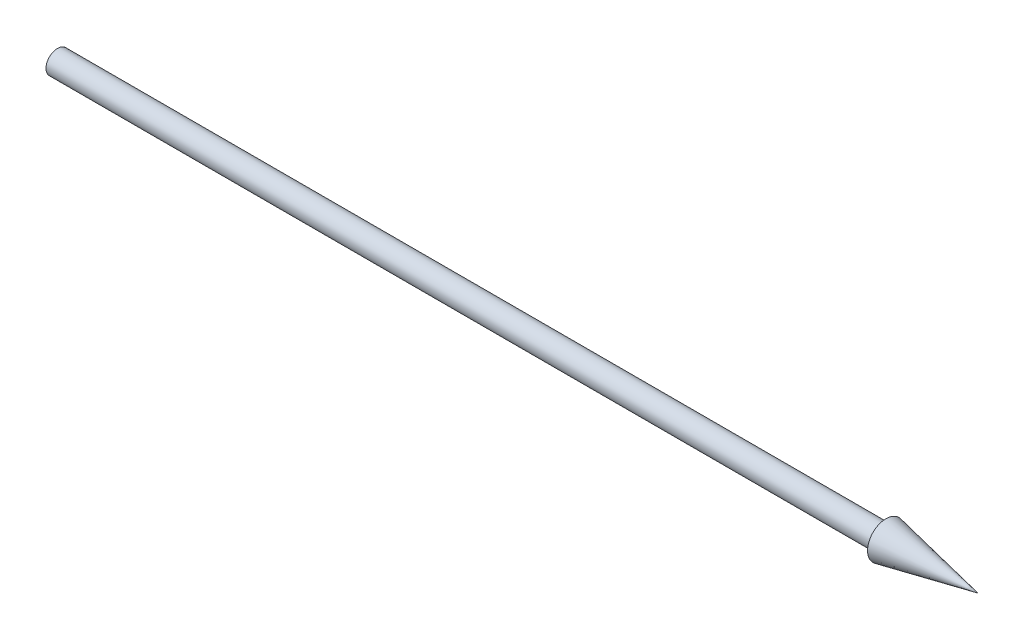
ISO-10303-21;
HEADER;
FILE_DESCRIPTION(('STEP AP214'),'2;1');
FILE_NAME('part.step','',(''),(''),'','','');
FILE_SCHEMA(('AUTOMOTIVE_DESIGN { 1 0 10303 214 1 1 1 1 }'));
ENDSEC;
DATA;
#1=APPLICATION_CONTEXT('core data for automotive mechanical design processes');
#2=APPLICATION_PROTOCOL_DEFINITION('international standard','automotive_design',2000,#1);
#3=PRODUCT_CONTEXT('',#1,'mechanical');
#4=PRODUCT('Part','Part','',(#3));
#5=PRODUCT_RELATED_PRODUCT_CATEGORY('part','',(#4));
#6=PRODUCT_DEFINITION_FORMATION('','',#4);
#7=PRODUCT_DEFINITION_CONTEXT('part definition',#1,'design');
#8=PRODUCT_DEFINITION('design','',#6,#7);
#9=PRODUCT_DEFINITION_SHAPE('','',#8);
#10=(LENGTH_UNIT() NAMED_UNIT(*) SI_UNIT(.MILLI.,.METRE.));
#11=(NAMED_UNIT(*) PLANE_ANGLE_UNIT() SI_UNIT($,.RADIAN.));
#12=(NAMED_UNIT(*) SI_UNIT($,.STERADIAN.) SOLID_ANGLE_UNIT());
#13=UNCERTAINTY_MEASURE_WITH_UNIT(LENGTH_MEASURE(1.E-05),#10,'distance_accuracy_value','');
#14=(GEOMETRIC_REPRESENTATION_CONTEXT(3) GLOBAL_UNCERTAINTY_ASSIGNED_CONTEXT((#13)) GLOBAL_UNIT_ASSIGNED_CONTEXT((#10,
#11,#12)) REPRESENTATION_CONTEXT('',''));
#15=CARTESIAN_POINT('',(0.,0.,0.));
#16=DIRECTION('',(0.,0.,1.));
#17=DIRECTION('',(1.,0.,0.));
#18=AXIS2_PLACEMENT_3D('',#15,#16,#17);
#19=CARTESIAN_POINT('',(0.,0.,0.));
#20=DIRECTION('',(1.,0.,0.));
#21=DIRECTION('',(0.,0.,-1.));
#22=AXIS2_PLACEMENT_3D('',#19,#20,#21);
#23=PLANE('',#22);
#24=CARTESIAN_POINT('',(0.,0.,0.));
#25=DIRECTION('',(-1.,0.,0.));
#26=DIRECTION('',(0.,0.,1.));
#27=AXIS2_PLACEMENT_3D('',#24,#25,#26);
#28=CIRCLE('',#27,2.5);
#29=CARTESIAN_POINT('',(0.,0.,2.5));
#30=VERTEX_POINT('',#29);
#31=EDGE_CURVE('E11',#30,#30,#28,.T.);
#32=ORIENTED_EDGE('',*,*,#31,.T.);
#33=EDGE_LOOP('',(#32));
#34=FACE_BOUND('',#33,.T.);
#35=ADVANCED_FACE('F33',(#34),#23,.F.);
#36=CARTESIAN_POINT('',(0.,0.,0.));
#37=DIRECTION('',(-1.,0.,0.));
#38=DIRECTION('',(0.,0.,1.));
#39=AXIS2_PLACEMENT_3D('',#36,#37,#38);
#40=CYLINDRICAL_SURFACE('',#39,2.5);
#41=ORIENTED_EDGE('',*,*,#31,.F.);
#42=EDGE_LOOP('',(#41));
#43=FACE_BOUND('',#42,.T.);
#44=CARTESIAN_POINT('',(180.,0.,0.));
#45=DIRECTION('',(-1.,0.,0.));
#46=DIRECTION('',(0.,0.,1.));
#47=AXIS2_PLACEMENT_3D('',#44,#45,#46);
#48=CIRCLE('',#47,2.5);
#49=CARTESIAN_POINT('',(180.,0.,2.5));
#50=VERTEX_POINT('',#49);
#51=EDGE_CURVE('E39',#50,#50,#48,.T.);
#52=ORIENTED_EDGE('',*,*,#51,.T.);
#53=EDGE_LOOP('',(#52));
#54=FACE_BOUND('',#53,.T.);
#55=ADVANCED_FACE('F50',(#43,#54),#40,.T.);
#56=CARTESIAN_POINT('',(180.,4.,0.));
#57=DIRECTION('',(1.,0.,0.));
#58=DIRECTION('',(0.,0.,-1.));
#59=AXIS2_PLACEMENT_3D('',#56,#57,#58);
#60=PLANE('',#59);
#61=ORIENTED_EDGE('',*,*,#51,.F.);
#62=EDGE_LOOP('',(#61));
#63=FACE_BOUND('',#62,.T.);
#64=CARTESIAN_POINT('',(180.,0.,0.));
#65=DIRECTION('',(-1.,0.,0.));
#66=DIRECTION('',(0.,0.,1.));
#67=AXIS2_PLACEMENT_3D('',#64,#65,#66);
#68=CIRCLE('',#67,4.);
#69=CARTESIAN_POINT('',(180.,0.,4.));
#70=VERTEX_POINT('',#69);
#71=EDGE_CURVE('E64',#70,#70,#68,.T.);
#72=ORIENTED_EDGE('',*,*,#71,.T.);
#73=EDGE_LOOP('',(#72));
#74=FACE_BOUND('',#73,.T.);
#75=ADVANCED_FACE('F44',(#63,#74),#60,.F.);
#76=CARTESIAN_POINT('',(200.,0.,0.));
#77=DIRECTION('',(-1.,0.,0.));
#78=DIRECTION('',(0.,0.,1.));
#79=AXIS2_PLACEMENT_3D('',#76,#77,#78);
#80=CONICAL_SURFACE('',#79,0.,0.197395559849881);
#81=ORIENTED_EDGE('',*,*,#71,.F.);
#82=EDGE_LOOP('',(#81));
#83=FACE_BOUND('',#82,.T.);
#84=CARTESIAN_POINT('',(200.,0.,0.));
#85=VERTEX_POINT('',#84);
#86=VERTEX_LOOP('',#85);
#87=FACE_BOUND('',#86,.T.);
#88=ADVANCED_FACE('F42',(#83,#87),#80,.T.);
#89=CLOSED_SHELL('',(#35,#55,#75,#88));
#90=MANIFOLD_SOLID_BREP('B2',#89);
#91=ADVANCED_BREP_SHAPE_REPRESENTATION('',(#18,#90),#14);
#92=SHAPE_DEFINITION_REPRESENTATION(#9,#91);
ENDSEC;
END-ISO-10303-21;
